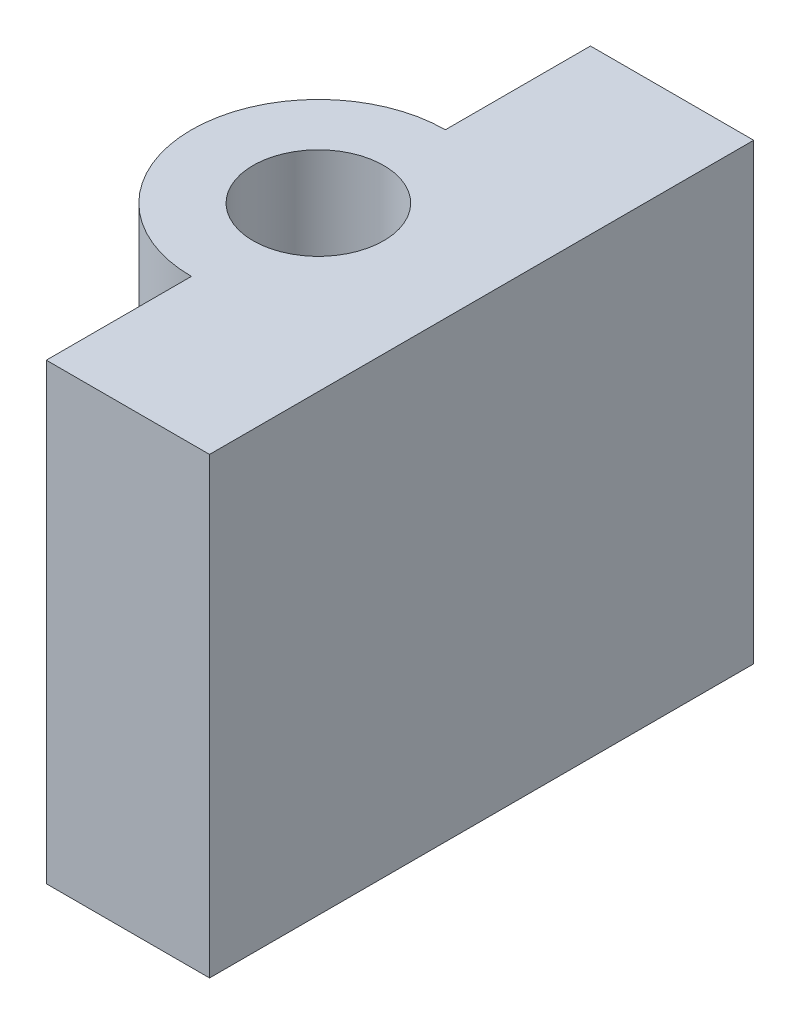
ISO-10303-21;
HEADER;
FILE_DESCRIPTION(('STEP AP214'),'2;1');
FILE_NAME('part.step','',(''),(''),'','','');
FILE_SCHEMA(('AUTOMOTIVE_DESIGN { 1 0 10303 214 1 1 1 1 }'));
ENDSEC;
DATA;
#1=APPLICATION_CONTEXT('core data for automotive mechanical design processes');
#2=APPLICATION_PROTOCOL_DEFINITION('international standard','automotive_design',2000,#1);
#3=PRODUCT_CONTEXT('',#1,'mechanical');
#4=PRODUCT('Part','Part','',(#3));
#5=PRODUCT_RELATED_PRODUCT_CATEGORY('part','',(#4));
#6=PRODUCT_DEFINITION_FORMATION('','',#4);
#7=PRODUCT_DEFINITION_CONTEXT('part definition',#1,'design');
#8=PRODUCT_DEFINITION('design','',#6,#7);
#9=PRODUCT_DEFINITION_SHAPE('','',#8);
#10=(LENGTH_UNIT() NAMED_UNIT(*) SI_UNIT(.MILLI.,.METRE.));
#11=(NAMED_UNIT(*) PLANE_ANGLE_UNIT() SI_UNIT($,.RADIAN.));
#12=(NAMED_UNIT(*) SI_UNIT($,.STERADIAN.) SOLID_ANGLE_UNIT());
#13=UNCERTAINTY_MEASURE_WITH_UNIT(LENGTH_MEASURE(1.E-05),#10,'distance_accuracy_value','');
#14=(GEOMETRIC_REPRESENTATION_CONTEXT(3) GLOBAL_UNCERTAINTY_ASSIGNED_CONTEXT((#13)) GLOBAL_UNIT_ASSIGNED_CONTEXT((#10,
#11,#12)) REPRESENTATION_CONTEXT('',''));
#15=CARTESIAN_POINT('',(0.,0.,0.));
#16=DIRECTION('',(0.,0.,1.));
#17=DIRECTION('',(1.,0.,0.));
#18=AXIS2_PLACEMENT_3D('',#15,#16,#17);
#19=CARTESIAN_POINT('',(0.,25.,0.));
#20=DIRECTION('',(0.,-1.,0.));
#21=DIRECTION('',(0.,0.,-1.));
#22=AXIS2_PLACEMENT_3D('',#19,#20,#21);
#23=CYLINDRICAL_SURFACE('',#22,7.);
#24=CARTESIAN_POINT('',(0.,25.,0.));
#25=DIRECTION('',(0.,1.,0.));
#26=DIRECTION('',(0.,0.,1.));
#27=AXIS2_PLACEMENT_3D('',#24,#25,#26);
#28=CIRCLE('',#27,7.);
#29=CARTESIAN_POINT('',(0.,25.,-7.));
#30=VERTEX_POINT('',#29);
#31=CARTESIAN_POINT('',(0.,25.,7.));
#32=VERTEX_POINT('',#31);
#33=EDGE_CURVE('E135',#30,#32,#28,.T.);
#34=ORIENTED_EDGE('',*,*,#33,.F.);
#35=DIRECTION('',(0.,-1.,0.));
#36=VECTOR('',#35,1.);
#37=CARTESIAN_POINT('',(0.,25.,-7.));
#38=LINE('',#37,#36);
#39=CARTESIAN_POINT('',(0.,0.,-7.));
#40=VERTEX_POINT('',#39);
#41=EDGE_CURVE('E11',#30,#40,#38,.T.);
#42=ORIENTED_EDGE('',*,*,#41,.T.);
#43=CARTESIAN_POINT('',(0.,0.,0.));
#44=DIRECTION('',(0.,1.,0.));
#45=DIRECTION('',(0.,0.,1.));
#46=AXIS2_PLACEMENT_3D('',#43,#44,#45);
#47=CIRCLE('',#46,7.);
#48=CARTESIAN_POINT('',(0.,0.,7.));
#49=VERTEX_POINT('',#48);
#50=EDGE_CURVE('E126',#40,#49,#47,.T.);
#51=ORIENTED_EDGE('',*,*,#50,.T.);
#52=DIRECTION('',(0.,-1.,0.));
#53=VECTOR('',#52,1.);
#54=CARTESIAN_POINT('',(0.,25.,7.));
#55=LINE('',#54,#53);
#56=EDGE_CURVE('E46',#49,#32,#55,.F.);
#57=ORIENTED_EDGE('',*,*,#56,.T.);
#58=EDGE_LOOP('',(#34,#42,#51,#57));
#59=FACE_BOUND('',#58,.T.);
#60=ADVANCED_FACE('F39',(#59),#23,.T.);
#61=CARTESIAN_POINT('',(0.,25.,0.));
#62=DIRECTION('',(0.,1.,0.));
#63=DIRECTION('',(0.,0.,1.));
#64=AXIS2_PLACEMENT_3D('',#61,#62,#63);
#65=PLANE('',#64);
#66=CARTESIAN_POINT('',(0.,25.,0.));
#67=DIRECTION('',(0.,1.,0.));
#68=DIRECTION('',(0.,0.,1.));
#69=AXIS2_PLACEMENT_3D('',#66,#67,#68);
#70=CIRCLE('',#69,3.6);
#71=CARTESIAN_POINT('',(0.,25.,3.6));
#72=VERTEX_POINT('',#71);
#73=EDGE_CURVE('E231',#72,#72,#70,.T.);
#74=ORIENTED_EDGE('',*,*,#73,.F.);
#75=EDGE_LOOP('',(#74));
#76=FACE_BOUND('',#75,.T.);
#77=ORIENTED_EDGE('',*,*,#33,.T.);
#78=DIRECTION('',(0.,0.,1.));
#79=VECTOR('',#78,1.);
#80=CARTESIAN_POINT('',(0.,25.,-15.));
#81=LINE('',#80,#79);
#82=CARTESIAN_POINT('',(0.,25.,15.));
#83=VERTEX_POINT('',#82);
#84=EDGE_CURVE('E52',#32,#83,#81,.T.);
#85=ORIENTED_EDGE('',*,*,#84,.T.);
#86=DIRECTION('',(1.,0.,0.));
#87=VECTOR('',#86,1.);
#88=CARTESIAN_POINT('',(0.,25.,15.));
#89=LINE('',#88,#87);
#90=CARTESIAN_POINT('',(9.,25.,15.));
#91=VERTEX_POINT('',#90);
#92=EDGE_CURVE('E105',#83,#91,#89,.T.);
#93=ORIENTED_EDGE('',*,*,#92,.T.);
#94=DIRECTION('',(0.,0.,-1.));
#95=VECTOR('',#94,1.);
#96=CARTESIAN_POINT('',(9.,25.,-15.));
#97=LINE('',#96,#95);
#98=CARTESIAN_POINT('',(9.,25.,-15.));
#99=VERTEX_POINT('',#98);
#100=EDGE_CURVE('E122',#91,#99,#97,.T.);
#101=ORIENTED_EDGE('',*,*,#100,.T.);
#102=DIRECTION('',(-1.,0.,0.));
#103=VECTOR('',#102,1.);
#104=CARTESIAN_POINT('',(0.,25.,-15.));
#105=LINE('',#104,#103);
#106=CARTESIAN_POINT('',(0.,25.,-15.));
#107=VERTEX_POINT('',#106);
#108=EDGE_CURVE('E92',#99,#107,#105,.T.);
#109=ORIENTED_EDGE('',*,*,#108,.T.);
#110=EDGE_CURVE('E120',#107,#30,#81,.T.);
#111=ORIENTED_EDGE('',*,*,#110,.T.);
#112=EDGE_LOOP('',(#77,#85,#93,#101,#109,#111));
#113=FACE_BOUND('',#112,.T.);
#114=ADVANCED_FACE('F140',(#76,#113),#65,.T.);
#115=CARTESIAN_POINT('',(0.,0.,0.));
#116=DIRECTION('',(0.,1.,0.));
#117=DIRECTION('',(0.,0.,1.));
#118=AXIS2_PLACEMENT_3D('',#115,#116,#117);
#119=PLANE('',#118);
#120=CARTESIAN_POINT('',(0.,0.,0.));
#121=DIRECTION('',(0.,1.,0.));
#122=DIRECTION('',(0.,0.,1.));
#123=AXIS2_PLACEMENT_3D('',#120,#121,#122);
#124=CIRCLE('',#123,3.6);
#125=CARTESIAN_POINT('',(0.,0.,3.6));
#126=VERTEX_POINT('',#125);
#127=EDGE_CURVE('E234',#126,#126,#124,.T.);
#128=ORIENTED_EDGE('',*,*,#127,.T.);
#129=EDGE_LOOP('',(#128));
#130=FACE_BOUND('',#129,.T.);
#131=ORIENTED_EDGE('',*,*,#50,.F.);
#132=DIRECTION('',(0.,0.,1.));
#133=VECTOR('',#132,1.);
#134=CARTESIAN_POINT('',(0.,0.,-15.));
#135=LINE('',#134,#133);
#136=CARTESIAN_POINT('',(0.,0.,-15.));
#137=VERTEX_POINT('',#136);
#138=EDGE_CURVE('E94',#137,#40,#135,.T.);
#139=ORIENTED_EDGE('',*,*,#138,.F.);
#140=DIRECTION('',(-1.,0.,0.));
#141=VECTOR('',#140,1.);
#142=CARTESIAN_POINT('',(0.,0.,-15.));
#143=LINE('',#142,#141);
#144=CARTESIAN_POINT('',(9.,0.,-15.));
#145=VERTEX_POINT('',#144);
#146=EDGE_CURVE('E102',#145,#137,#143,.T.);
#147=ORIENTED_EDGE('',*,*,#146,.F.);
#148=DIRECTION('',(0.,0.,-1.));
#149=VECTOR('',#148,1.);
#150=CARTESIAN_POINT('',(9.,0.,-15.));
#151=LINE('',#150,#149);
#152=CARTESIAN_POINT('',(9.,0.,15.));
#153=VERTEX_POINT('',#152);
#154=EDGE_CURVE('E109',#153,#145,#151,.T.);
#155=ORIENTED_EDGE('',*,*,#154,.F.);
#156=DIRECTION('',(1.,0.,0.));
#157=VECTOR('',#156,1.);
#158=CARTESIAN_POINT('',(0.,0.,15.));
#159=LINE('',#158,#157);
#160=CARTESIAN_POINT('',(0.,0.,15.));
#161=VERTEX_POINT('',#160);
#162=EDGE_CURVE('E99',#161,#153,#159,.T.);
#163=ORIENTED_EDGE('',*,*,#162,.F.);
#164=EDGE_CURVE('E83',#49,#161,#135,.T.);
#165=ORIENTED_EDGE('',*,*,#164,.F.);
#166=EDGE_LOOP('',(#131,#139,#147,#155,#163,#165));
#167=FACE_BOUND('',#166,.T.);
#168=ADVANCED_FACE('F110',(#130,#167),#119,.F.);
#169=CARTESIAN_POINT('',(0.,0.,-15.));
#170=DIRECTION('',(-1.,0.,0.));
#171=DIRECTION('',(0.,0.,1.));
#172=AXIS2_PLACEMENT_3D('',#169,#170,#171);
#173=PLANE('',#172);
#174=ORIENTED_EDGE('',*,*,#41,.F.);
#175=ORIENTED_EDGE('',*,*,#110,.F.);
#176=DIRECTION('',(0.,1.,0.));
#177=VECTOR('',#176,1.);
#178=CARTESIAN_POINT('',(0.,0.,-15.));
#179=LINE('',#178,#177);
#180=EDGE_CURVE('E127',#137,#107,#179,.T.);
#181=ORIENTED_EDGE('',*,*,#180,.F.);
#182=ORIENTED_EDGE('',*,*,#138,.T.);
#183=EDGE_LOOP('',(#174,#175,#181,#182));
#184=FACE_BOUND('',#183,.T.);
#185=ADVANCED_FACE('F142',(#184),#173,.T.);
#186=ORIENTED_EDGE('',*,*,#56,.F.);
#187=ORIENTED_EDGE('',*,*,#164,.T.);
#188=DIRECTION('',(0.,1.,0.));
#189=VECTOR('',#188,1.);
#190=CARTESIAN_POINT('',(0.,0.,15.));
#191=LINE('',#190,#189);
#192=EDGE_CURVE('E86',#161,#83,#191,.T.);
#193=ORIENTED_EDGE('',*,*,#192,.T.);
#194=ORIENTED_EDGE('',*,*,#84,.F.);
#195=EDGE_LOOP('',(#186,#187,#193,#194));
#196=FACE_BOUND('',#195,.T.);
#197=ADVANCED_FACE('F87',(#196),#173,.T.);
#198=CARTESIAN_POINT('',(0.,0.,-15.));
#199=DIRECTION('',(0.,0.,-1.));
#200=DIRECTION('',(-1.,0.,0.));
#201=AXIS2_PLACEMENT_3D('',#198,#199,#200);
#202=PLANE('',#201);
#203=ORIENTED_EDGE('',*,*,#108,.F.);
#204=DIRECTION('',(0.,1.,0.));
#205=VECTOR('',#204,1.);
#206=CARTESIAN_POINT('',(9.,0.,-15.));
#207=LINE('',#206,#205);
#208=EDGE_CURVE('E129',#145,#99,#207,.T.);
#209=ORIENTED_EDGE('',*,*,#208,.F.);
#210=ORIENTED_EDGE('',*,*,#146,.T.);
#211=ORIENTED_EDGE('',*,*,#180,.T.);
#212=EDGE_LOOP('',(#203,#209,#210,#211));
#213=FACE_BOUND('',#212,.T.);
#214=ADVANCED_FACE('F144',(#213),#202,.T.);
#215=CARTESIAN_POINT('',(9.,0.,-15.));
#216=DIRECTION('',(1.,0.,0.));
#217=DIRECTION('',(0.,0.,-1.));
#218=AXIS2_PLACEMENT_3D('',#215,#216,#217);
#219=PLANE('',#218);
#220=ORIENTED_EDGE('',*,*,#100,.F.);
#221=DIRECTION('',(0.,1.,0.));
#222=VECTOR('',#221,1.);
#223=CARTESIAN_POINT('',(9.,0.,15.));
#224=LINE('',#223,#222);
#225=EDGE_CURVE('E103',#153,#91,#224,.T.);
#226=ORIENTED_EDGE('',*,*,#225,.F.);
#227=ORIENTED_EDGE('',*,*,#154,.T.);
#228=ORIENTED_EDGE('',*,*,#208,.T.);
#229=EDGE_LOOP('',(#220,#226,#227,#228));
#230=FACE_BOUND('',#229,.T.);
#231=ADVANCED_FACE('F146',(#230),#219,.T.);
#232=CARTESIAN_POINT('',(0.,0.,15.));
#233=DIRECTION('',(0.,0.,1.));
#234=DIRECTION('',(1.,0.,0.));
#235=AXIS2_PLACEMENT_3D('',#232,#233,#234);
#236=PLANE('',#235);
#237=ORIENTED_EDGE('',*,*,#92,.F.);
#238=ORIENTED_EDGE('',*,*,#192,.F.);
#239=ORIENTED_EDGE('',*,*,#162,.T.);
#240=ORIENTED_EDGE('',*,*,#225,.T.);
#241=EDGE_LOOP('',(#237,#238,#239,#240));
#242=FACE_BOUND('',#241,.T.);
#243=ADVANCED_FACE('F97',(#242),#236,.T.);
#244=CARTESIAN_POINT('',(0.,0.,0.));
#245=DIRECTION('',(0.,1.,0.));
#246=DIRECTION('',(0.,0.,1.));
#247=AXIS2_PLACEMENT_3D('',#244,#245,#246);
#248=CYLINDRICAL_SURFACE('',#247,3.6);
#249=ORIENTED_EDGE('',*,*,#127,.F.);
#250=EDGE_LOOP('',(#249));
#251=FACE_BOUND('',#250,.T.);
#252=ORIENTED_EDGE('',*,*,#73,.T.);
#253=EDGE_LOOP('',(#252));
#254=FACE_BOUND('',#253,.T.);
#255=ADVANCED_FACE('F154',(#251,#254),#248,.F.);
#256=CLOSED_SHELL('',(#60,#114,#168,#185,#197,#214,#231,#243,#255));
#257=MANIFOLD_SOLID_BREP('B2',#256);
#258=ADVANCED_BREP_SHAPE_REPRESENTATION('',(#18,#257),#14);
#259=SHAPE_DEFINITION_REPRESENTATION(#9,#258);
ENDSEC;
END-ISO-10303-21;
